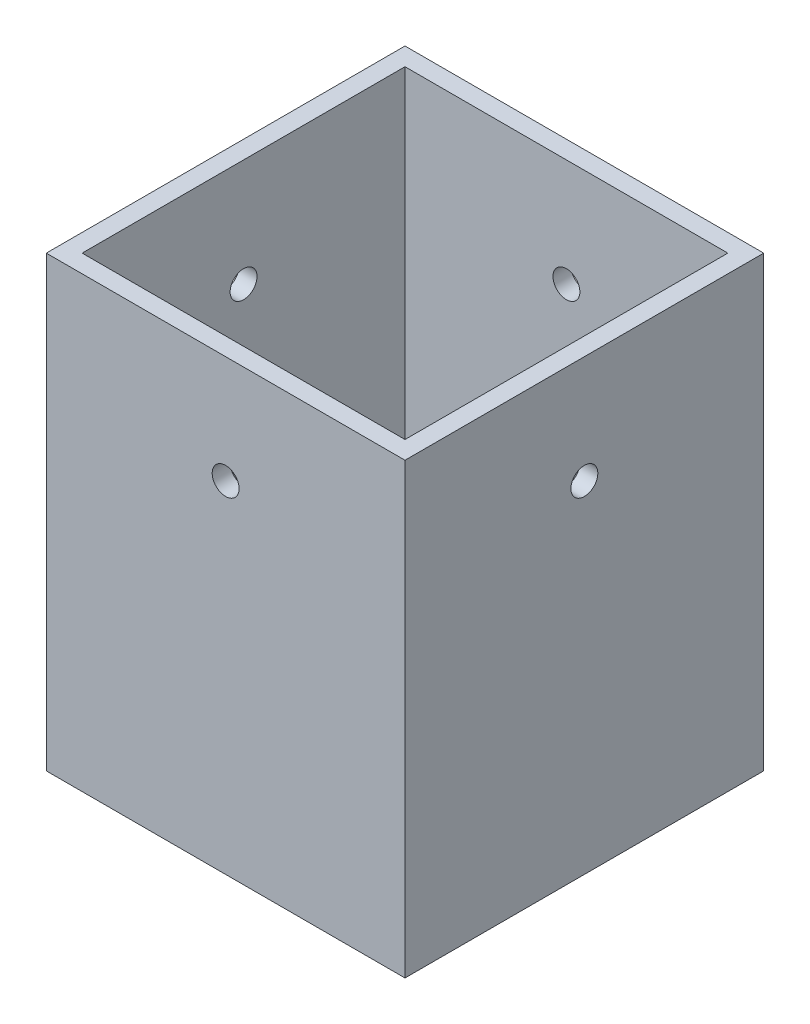
ISO-10303-21;
HEADER;
FILE_DESCRIPTION(('STEP AP214'),'2;1');
FILE_NAME('part.step','',(''),(''),'','','');
FILE_SCHEMA(('AUTOMOTIVE_DESIGN { 1 0 10303 214 1 1 1 1 }'));
ENDSEC;
DATA;
#1=APPLICATION_CONTEXT('core data for automotive mechanical design processes');
#2=APPLICATION_PROTOCOL_DEFINITION('international standard','automotive_design',2000,#1);
#3=PRODUCT_CONTEXT('',#1,'mechanical');
#4=PRODUCT('Part','Part','',(#3));
#5=PRODUCT_RELATED_PRODUCT_CATEGORY('part','',(#4));
#6=PRODUCT_DEFINITION_FORMATION('','',#4);
#7=PRODUCT_DEFINITION_CONTEXT('part definition',#1,'design');
#8=PRODUCT_DEFINITION('design','',#6,#7);
#9=PRODUCT_DEFINITION_SHAPE('','',#8);
#10=(LENGTH_UNIT() NAMED_UNIT(*) SI_UNIT(.MILLI.,.METRE.));
#11=(NAMED_UNIT(*) PLANE_ANGLE_UNIT() SI_UNIT($,.RADIAN.));
#12=(NAMED_UNIT(*) SI_UNIT($,.STERADIAN.) SOLID_ANGLE_UNIT());
#13=UNCERTAINTY_MEASURE_WITH_UNIT(LENGTH_MEASURE(1.E-05),#10,'distance_accuracy_value','');
#14=(GEOMETRIC_REPRESENTATION_CONTEXT(3) GLOBAL_UNCERTAINTY_ASSIGNED_CONTEXT((#13)) GLOBAL_UNIT_ASSIGNED_CONTEXT((#10,
#11,#12)) REPRESENTATION_CONTEXT('',''));
#15=CARTESIAN_POINT('',(0.,0.,0.));
#16=DIRECTION('',(0.,0.,1.));
#17=DIRECTION('',(1.,0.,0.));
#18=AXIS2_PLACEMENT_3D('',#15,#16,#17);
#19=CARTESIAN_POINT('',(0.,50.,0.));
#20=DIRECTION('',(1.,0.,0.));
#21=DIRECTION('',(0.,0.,-1.));
#22=AXIS2_PLACEMENT_3D('',#19,#20,#21);
#23=PLANE('',#22);
#24=CARTESIAN_POINT('',(0.,38.,20.));
#25=DIRECTION('',(1.,0.,0.));
#26=DIRECTION('',(0.,0.,-1.));
#27=AXIS2_PLACEMENT_3D('',#24,#25,#26);
#28=CIRCLE('',#27,1.5);
#29=CARTESIAN_POINT('',(0.,38.,18.5));
#30=VERTEX_POINT('',#29);
#31=EDGE_CURVE('E179',#30,#30,#28,.T.);
#32=ORIENTED_EDGE('',*,*,#31,.T.);
#33=EDGE_LOOP('',(#32));
#34=FACE_BOUND('',#33,.T.);
#35=DIRECTION('',(0.,0.,1.));
#36=VECTOR('',#35,1.);
#37=CARTESIAN_POINT('',(0.,0.,0.));
#38=LINE('',#37,#36);
#39=CARTESIAN_POINT('',(0.,0.,0.));
#40=VERTEX_POINT('',#39);
#41=CARTESIAN_POINT('',(0.,0.,40.));
#42=VERTEX_POINT('',#41);
#43=EDGE_CURVE('E149',#40,#42,#38,.T.);
#44=ORIENTED_EDGE('',*,*,#43,.T.);
#45=DIRECTION('',(0.,-1.,0.));
#46=VECTOR('',#45,1.);
#47=CARTESIAN_POINT('',(0.,50.,40.));
#48=LINE('',#47,#46);
#49=CARTESIAN_POINT('',(0.,50.,40.));
#50=VERTEX_POINT('',#49);
#51=EDGE_CURVE('E11',#50,#42,#48,.T.);
#52=ORIENTED_EDGE('',*,*,#51,.F.);
#53=DIRECTION('',(0.,0.,1.));
#54=VECTOR('',#53,1.);
#55=CARTESIAN_POINT('',(0.,50.,0.));
#56=LINE('',#55,#54);
#57=CARTESIAN_POINT('',(0.,50.,0.));
#58=VERTEX_POINT('',#57);
#59=EDGE_CURVE('E153',#58,#50,#56,.T.);
#60=ORIENTED_EDGE('',*,*,#59,.F.);
#61=DIRECTION('',(0.,-1.,0.));
#62=VECTOR('',#61,1.);
#63=CARTESIAN_POINT('',(0.,50.,0.));
#64=LINE('',#63,#62);
#65=EDGE_CURVE('E159',#58,#40,#64,.T.);
#66=ORIENTED_EDGE('',*,*,#65,.T.);
#67=EDGE_LOOP('',(#44,#52,#60,#66));
#68=FACE_BOUND('',#67,.T.);
#69=ADVANCED_FACE('F36',(#34,#68),#23,.F.);
#70=CARTESIAN_POINT('',(0.,50.,40.));
#71=DIRECTION('',(0.,0.,-1.));
#72=DIRECTION('',(-1.,0.,0.));
#73=AXIS2_PLACEMENT_3D('',#70,#71,#72);
#74=PLANE('',#73);
#75=CARTESIAN_POINT('',(20.,38.,40.));
#76=DIRECTION('',(0.,0.,1.));
#77=DIRECTION('',(1.,0.,0.));
#78=AXIS2_PLACEMENT_3D('',#75,#76,#77);
#79=CIRCLE('',#78,1.5);
#80=CARTESIAN_POINT('',(21.5,38.,40.));
#81=VERTEX_POINT('',#80);
#82=EDGE_CURVE('E174',#81,#81,#79,.T.);
#83=ORIENTED_EDGE('',*,*,#82,.F.);
#84=EDGE_LOOP('',(#83));
#85=FACE_BOUND('',#84,.T.);
#86=DIRECTION('',(1.,0.,0.));
#87=VECTOR('',#86,1.);
#88=CARTESIAN_POINT('',(0.,0.,40.));
#89=LINE('',#88,#87);
#90=CARTESIAN_POINT('',(40.,0.,40.));
#91=VERTEX_POINT('',#90);
#92=EDGE_CURVE('E162',#42,#91,#89,.T.);
#93=ORIENTED_EDGE('',*,*,#92,.T.);
#94=DIRECTION('',(0.,-1.,0.));
#95=VECTOR('',#94,1.);
#96=CARTESIAN_POINT('',(40.,50.,40.));
#97=LINE('',#96,#95);
#98=CARTESIAN_POINT('',(40.,50.,40.));
#99=VERTEX_POINT('',#98);
#100=EDGE_CURVE('E44',#99,#91,#97,.T.);
#101=ORIENTED_EDGE('',*,*,#100,.F.);
#102=DIRECTION('',(1.,0.,0.));
#103=VECTOR('',#102,1.);
#104=CARTESIAN_POINT('',(0.,50.,40.));
#105=LINE('',#104,#103);
#106=EDGE_CURVE('E89',#50,#99,#105,.T.);
#107=ORIENTED_EDGE('',*,*,#106,.F.);
#108=ORIENTED_EDGE('',*,*,#51,.T.);
#109=EDGE_LOOP('',(#93,#101,#107,#108));
#110=FACE_BOUND('',#109,.T.);
#111=ADVANCED_FACE('F213',(#85,#110),#74,.F.);
#112=CARTESIAN_POINT('',(40.,50.,0.));
#113=DIRECTION('',(-1.,0.,0.));
#114=DIRECTION('',(0.,0.,1.));
#115=AXIS2_PLACEMENT_3D('',#112,#113,#114);
#116=PLANE('',#115);
#117=CARTESIAN_POINT('',(40.,38.,20.));
#118=DIRECTION('',(1.,0.,0.));
#119=DIRECTION('',(0.,0.,-1.));
#120=AXIS2_PLACEMENT_3D('',#117,#118,#119);
#121=CIRCLE('',#120,1.5);
#122=CARTESIAN_POINT('',(40.,38.,18.5));
#123=VERTEX_POINT('',#122);
#124=EDGE_CURVE('E189',#123,#123,#121,.T.);
#125=ORIENTED_EDGE('',*,*,#124,.F.);
#126=EDGE_LOOP('',(#125));
#127=FACE_BOUND('',#126,.T.);
#128=DIRECTION('',(0.,0.,-1.));
#129=VECTOR('',#128,1.);
#130=CARTESIAN_POINT('',(40.,0.,0.));
#131=LINE('',#130,#129);
#132=CARTESIAN_POINT('',(40.,0.,0.));
#133=VERTEX_POINT('',#132);
#134=EDGE_CURVE('E164',#91,#133,#131,.T.);
#135=ORIENTED_EDGE('',*,*,#134,.T.);
#136=DIRECTION('',(0.,-1.,0.));
#137=VECTOR('',#136,1.);
#138=CARTESIAN_POINT('',(40.,50.,0.));
#139=LINE('',#138,#137);
#140=CARTESIAN_POINT('',(40.,50.,0.));
#141=VERTEX_POINT('',#140);
#142=EDGE_CURVE('E168',#141,#133,#139,.T.);
#143=ORIENTED_EDGE('',*,*,#142,.F.);
#144=DIRECTION('',(0.,0.,-1.));
#145=VECTOR('',#144,1.);
#146=CARTESIAN_POINT('',(40.,50.,0.));
#147=LINE('',#146,#145);
#148=EDGE_CURVE('E156',#99,#141,#147,.T.);
#149=ORIENTED_EDGE('',*,*,#148,.F.);
#150=ORIENTED_EDGE('',*,*,#100,.T.);
#151=EDGE_LOOP('',(#135,#143,#149,#150));
#152=FACE_BOUND('',#151,.T.);
#153=ADVANCED_FACE('F218',(#127,#152),#116,.F.);
#154=CARTESIAN_POINT('',(0.,50.,0.));
#155=DIRECTION('',(0.,0.,1.));
#156=DIRECTION('',(1.,0.,0.));
#157=AXIS2_PLACEMENT_3D('',#154,#155,#156);
#158=PLANE('',#157);
#159=CARTESIAN_POINT('',(20.,38.,0.));
#160=DIRECTION('',(0.,0.,1.));
#161=DIRECTION('',(1.,0.,0.));
#162=AXIS2_PLACEMENT_3D('',#159,#160,#161);
#163=CIRCLE('',#162,1.5);
#164=CARTESIAN_POINT('',(21.5,38.,0.));
#165=VERTEX_POINT('',#164);
#166=EDGE_CURVE('E137',#165,#165,#163,.T.);
#167=ORIENTED_EDGE('',*,*,#166,.T.);
#168=EDGE_LOOP('',(#167));
#169=FACE_BOUND('',#168,.T.);
#170=DIRECTION('',(-1.,0.,0.));
#171=VECTOR('',#170,1.);
#172=CARTESIAN_POINT('',(0.,0.,0.));
#173=LINE('',#172,#171);
#174=EDGE_CURVE('E82',#133,#40,#173,.T.);
#175=ORIENTED_EDGE('',*,*,#174,.T.);
#176=ORIENTED_EDGE('',*,*,#65,.F.);
#177=DIRECTION('',(-1.,0.,0.));
#178=VECTOR('',#177,1.);
#179=CARTESIAN_POINT('',(0.,50.,0.));
#180=LINE('',#179,#178);
#181=EDGE_CURVE('E61',#141,#58,#180,.T.);
#182=ORIENTED_EDGE('',*,*,#181,.F.);
#183=ORIENTED_EDGE('',*,*,#142,.T.);
#184=EDGE_LOOP('',(#175,#176,#182,#183));
#185=FACE_BOUND('',#184,.T.);
#186=ADVANCED_FACE('F233',(#169,#185),#158,.F.);
#187=CARTESIAN_POINT('',(0.,50.,0.));
#188=DIRECTION('',(0.,1.,0.));
#189=DIRECTION('',(0.,0.,1.));
#190=AXIS2_PLACEMENT_3D('',#187,#188,#189);
#191=PLANE('',#190);
#192=DIRECTION('',(0.,0.,1.));
#193=VECTOR('',#192,1.);
#194=CARTESIAN_POINT('',(2.,50.,38.));
#195=LINE('',#194,#193);
#196=CARTESIAN_POINT('',(2.,50.,2.));
#197=VERTEX_POINT('',#196);
#198=CARTESIAN_POINT('',(2.,50.,38.));
#199=VERTEX_POINT('',#198);
#200=EDGE_CURVE('E52',#197,#199,#195,.T.);
#201=ORIENTED_EDGE('',*,*,#200,.F.);
#202=DIRECTION('',(-1.,0.,0.));
#203=VECTOR('',#202,1.);
#204=CARTESIAN_POINT('',(38.,50.,1.99999999999999));
#205=LINE('',#204,#203);
#206=CARTESIAN_POINT('',(38.,50.,1.99999999999999));
#207=VERTEX_POINT('',#206);
#208=EDGE_CURVE('E131',#207,#197,#205,.T.);
#209=ORIENTED_EDGE('',*,*,#208,.F.);
#210=DIRECTION('',(0.,0.,-1.));
#211=VECTOR('',#210,1.);
#212=CARTESIAN_POINT('',(38.,50.,38.));
#213=LINE('',#212,#211);
#214=CARTESIAN_POINT('',(38.,50.,38.));
#215=VERTEX_POINT('',#214);
#216=EDGE_CURVE('E134',#215,#207,#213,.T.);
#217=ORIENTED_EDGE('',*,*,#216,.F.);
#218=DIRECTION('',(1.,0.,0.));
#219=VECTOR('',#218,1.);
#220=CARTESIAN_POINT('',(38.,50.,38.));
#221=LINE('',#220,#219);
#222=EDGE_CURVE('E143',#199,#215,#221,.T.);
#223=ORIENTED_EDGE('',*,*,#222,.F.);
#224=EDGE_LOOP('',(#201,#209,#217,#223));
#225=FACE_BOUND('',#224,.T.);
#226=ORIENTED_EDGE('',*,*,#59,.T.);
#227=ORIENTED_EDGE('',*,*,#106,.T.);
#228=ORIENTED_EDGE('',*,*,#148,.T.);
#229=ORIENTED_EDGE('',*,*,#181,.T.);
#230=EDGE_LOOP('',(#226,#227,#228,#229));
#231=FACE_BOUND('',#230,.T.);
#232=ADVANCED_FACE('F231',(#225,#231),#191,.T.);
#233=CARTESIAN_POINT('',(0.,0.,0.));
#234=DIRECTION('',(0.,1.,0.));
#235=DIRECTION('',(0.,0.,1.));
#236=AXIS2_PLACEMENT_3D('',#233,#234,#235);
#237=PLANE('',#236);
#238=ORIENTED_EDGE('',*,*,#43,.F.);
#239=ORIENTED_EDGE('',*,*,#174,.F.);
#240=ORIENTED_EDGE('',*,*,#134,.F.);
#241=ORIENTED_EDGE('',*,*,#92,.F.);
#242=EDGE_LOOP('',(#238,#239,#240,#241));
#243=FACE_BOUND('',#242,.T.);
#244=ADVANCED_FACE('F226',(#243),#237,.F.);
#245=CARTESIAN_POINT('',(2.,4.,38.));
#246=DIRECTION('',(-1.,0.,0.));
#247=DIRECTION('',(0.,0.,1.));
#248=AXIS2_PLACEMENT_3D('',#245,#246,#247);
#249=PLANE('',#248);
#250=CARTESIAN_POINT('',(2.,38.,20.));
#251=DIRECTION('',(-1.,0.,0.));
#252=DIRECTION('',(0.,0.,1.));
#253=AXIS2_PLACEMENT_3D('',#250,#251,#252);
#254=CIRCLE('',#253,1.5);
#255=CARTESIAN_POINT('',(2.,38.,21.5));
#256=VERTEX_POINT('',#255);
#257=EDGE_CURVE('E184',#256,#256,#254,.T.);
#258=ORIENTED_EDGE('',*,*,#257,.T.);
#259=EDGE_LOOP('',(#258));
#260=FACE_BOUND('',#259,.T.);
#261=ORIENTED_EDGE('',*,*,#200,.T.);
#262=DIRECTION('',(0.,1.,0.));
#263=VECTOR('',#262,1.);
#264=CARTESIAN_POINT('',(2.,4.,38.));
#265=LINE('',#264,#263);
#266=CARTESIAN_POINT('',(2.,4.,38.));
#267=VERTEX_POINT('',#266);
#268=EDGE_CURVE('E109',#267,#199,#265,.T.);
#269=ORIENTED_EDGE('',*,*,#268,.F.);
#270=DIRECTION('',(0.,0.,1.));
#271=VECTOR('',#270,1.);
#272=CARTESIAN_POINT('',(2.,4.,38.));
#273=LINE('',#272,#271);
#274=CARTESIAN_POINT('',(2.,4.,2.));
#275=VERTEX_POINT('',#274);
#276=EDGE_CURVE('E113',#275,#267,#273,.T.);
#277=ORIENTED_EDGE('',*,*,#276,.F.);
#278=DIRECTION('',(0.,1.,0.));
#279=VECTOR('',#278,1.);
#280=CARTESIAN_POINT('',(2.,4.,2.));
#281=LINE('',#280,#279);
#282=EDGE_CURVE('E147',#275,#197,#281,.T.);
#283=ORIENTED_EDGE('',*,*,#282,.T.);
#284=EDGE_LOOP('',(#261,#269,#277,#283));
#285=FACE_BOUND('',#284,.T.);
#286=ADVANCED_FACE('F111',(#260,#285),#249,.F.);
#287=CARTESIAN_POINT('',(38.,4.,1.99999999999999));
#288=DIRECTION('',(0.,0.,-1.));
#289=DIRECTION('',(-1.,0.,0.));
#290=AXIS2_PLACEMENT_3D('',#287,#288,#289);
#291=PLANE('',#290);
#292=CARTESIAN_POINT('',(20.,38.,1.99999999999999));
#293=DIRECTION('',(0.,0.,-1.));
#294=DIRECTION('',(-1.,0.,0.));
#295=AXIS2_PLACEMENT_3D('',#292,#293,#294);
#296=CIRCLE('',#295,1.5);
#297=CARTESIAN_POINT('',(18.5,38.,1.99999999999999));
#298=VERTEX_POINT('',#297);
#299=EDGE_CURVE('E173',#298,#298,#296,.T.);
#300=ORIENTED_EDGE('',*,*,#299,.T.);
#301=EDGE_LOOP('',(#300));
#302=FACE_BOUND('',#301,.T.);
#303=ORIENTED_EDGE('',*,*,#208,.T.);
#304=ORIENTED_EDGE('',*,*,#282,.F.);
#305=DIRECTION('',(-1.,0.,0.));
#306=VECTOR('',#305,1.);
#307=CARTESIAN_POINT('',(38.,4.,1.99999999999999));
#308=LINE('',#307,#306);
#309=CARTESIAN_POINT('',(38.,4.,1.99999999999999));
#310=VERTEX_POINT('',#309);
#311=EDGE_CURVE('E119',#310,#275,#308,.T.);
#312=ORIENTED_EDGE('',*,*,#311,.F.);
#313=DIRECTION('',(0.,1.,0.));
#314=VECTOR('',#313,1.);
#315=CARTESIAN_POINT('',(38.,4.,1.99999999999999));
#316=LINE('',#315,#314);
#317=EDGE_CURVE('E150',#310,#207,#316,.T.);
#318=ORIENTED_EDGE('',*,*,#317,.T.);
#319=EDGE_LOOP('',(#303,#304,#312,#318));
#320=FACE_BOUND('',#319,.T.);
#321=ADVANCED_FACE('F266',(#302,#320),#291,.F.);
#322=CARTESIAN_POINT('',(38.,4.,38.));
#323=DIRECTION('',(1.,0.,0.));
#324=DIRECTION('',(0.,0.,-1.));
#325=AXIS2_PLACEMENT_3D('',#322,#323,#324);
#326=PLANE('',#325);
#327=CARTESIAN_POINT('',(38.,38.,20.));
#328=DIRECTION('',(1.,0.,0.));
#329=DIRECTION('',(0.,0.,-1.));
#330=AXIS2_PLACEMENT_3D('',#327,#328,#329);
#331=CIRCLE('',#330,1.5);
#332=CARTESIAN_POINT('',(38.,38.,18.5));
#333=VERTEX_POINT('',#332);
#334=EDGE_CURVE('E39',#333,#333,#331,.T.);
#335=ORIENTED_EDGE('',*,*,#334,.T.);
#336=EDGE_LOOP('',(#335));
#337=FACE_BOUND('',#336,.T.);
#338=ORIENTED_EDGE('',*,*,#216,.T.);
#339=ORIENTED_EDGE('',*,*,#317,.F.);
#340=DIRECTION('',(0.,0.,-1.));
#341=VECTOR('',#340,1.);
#342=CARTESIAN_POINT('',(38.,4.,38.));
#343=LINE('',#342,#341);
#344=CARTESIAN_POINT('',(38.,4.,38.));
#345=VERTEX_POINT('',#344);
#346=EDGE_CURVE('E127',#345,#310,#343,.T.);
#347=ORIENTED_EDGE('',*,*,#346,.F.);
#348=DIRECTION('',(0.,1.,0.));
#349=VECTOR('',#348,1.);
#350=CARTESIAN_POINT('',(38.,4.,38.));
#351=LINE('',#350,#349);
#352=EDGE_CURVE('E118',#345,#215,#351,.T.);
#353=ORIENTED_EDGE('',*,*,#352,.T.);
#354=EDGE_LOOP('',(#338,#339,#347,#353));
#355=FACE_BOUND('',#354,.T.);
#356=ADVANCED_FACE('F196',(#337,#355),#326,.F.);
#357=CARTESIAN_POINT('',(38.,4.,38.));
#358=DIRECTION('',(0.,0.,1.));
#359=DIRECTION('',(1.,0.,0.));
#360=AXIS2_PLACEMENT_3D('',#357,#358,#359);
#361=PLANE('',#360);
#362=CARTESIAN_POINT('',(20.,38.,38.));
#363=DIRECTION('',(0.,0.,1.));
#364=DIRECTION('',(1.,0.,0.));
#365=AXIS2_PLACEMENT_3D('',#362,#363,#364);
#366=CIRCLE('',#365,1.5);
#367=CARTESIAN_POINT('',(21.5,38.,38.));
#368=VERTEX_POINT('',#367);
#369=EDGE_CURVE('E171',#368,#368,#366,.T.);
#370=ORIENTED_EDGE('',*,*,#369,.T.);
#371=EDGE_LOOP('',(#370));
#372=FACE_BOUND('',#371,.T.);
#373=ORIENTED_EDGE('',*,*,#222,.T.);
#374=ORIENTED_EDGE('',*,*,#352,.F.);
#375=DIRECTION('',(1.,0.,0.));
#376=VECTOR('',#375,1.);
#377=CARTESIAN_POINT('',(38.,4.,38.));
#378=LINE('',#377,#376);
#379=EDGE_CURVE('E122',#267,#345,#378,.T.);
#380=ORIENTED_EDGE('',*,*,#379,.F.);
#381=ORIENTED_EDGE('',*,*,#268,.T.);
#382=EDGE_LOOP('',(#373,#374,#380,#381));
#383=FACE_BOUND('',#382,.T.);
#384=ADVANCED_FACE('F123',(#372,#383),#361,.F.);
#385=CARTESIAN_POINT('',(0.,4.,0.));
#386=DIRECTION('',(0.,1.,0.));
#387=DIRECTION('',(0.,0.,1.));
#388=AXIS2_PLACEMENT_3D('',#385,#386,#387);
#389=PLANE('',#388);
#390=ORIENTED_EDGE('',*,*,#276,.T.);
#391=ORIENTED_EDGE('',*,*,#379,.T.);
#392=ORIENTED_EDGE('',*,*,#346,.T.);
#393=ORIENTED_EDGE('',*,*,#311,.T.);
#394=EDGE_LOOP('',(#390,#391,#392,#393));
#395=FACE_BOUND('',#394,.T.);
#396=ADVANCED_FACE('F129',(#395),#389,.T.);
#397=CARTESIAN_POINT('',(20.,38.,-6.));
#398=DIRECTION('',(0.,0.,1.));
#399=DIRECTION('',(1.,0.,0.));
#400=AXIS2_PLACEMENT_3D('',#397,#398,#399);
#401=CYLINDRICAL_SURFACE('',#400,1.5);
#402=ORIENTED_EDGE('',*,*,#82,.T.);
#403=EDGE_LOOP('',(#402));
#404=FACE_BOUND('',#403,.T.);
#405=ORIENTED_EDGE('',*,*,#369,.F.);
#406=EDGE_LOOP('',(#405));
#407=FACE_BOUND('',#406,.T.);
#408=ADVANCED_FACE('F209',(#404,#407),#401,.F.);
#409=ORIENTED_EDGE('',*,*,#299,.F.);
#410=EDGE_LOOP('',(#409));
#411=FACE_BOUND('',#410,.T.);
#412=ORIENTED_EDGE('',*,*,#166,.F.);
#413=EDGE_LOOP('',(#412));
#414=FACE_BOUND('',#413,.T.);
#415=ADVANCED_FACE('F202',(#411,#414),#401,.F.);
#416=CARTESIAN_POINT('',(-6.,38.,20.));
#417=DIRECTION('',(1.,0.,0.));
#418=DIRECTION('',(0.,0.,-1.));
#419=AXIS2_PLACEMENT_3D('',#416,#417,#418);
#420=CYLINDRICAL_SURFACE('',#419,1.5);
#421=ORIENTED_EDGE('',*,*,#124,.T.);
#422=EDGE_LOOP('',(#421));
#423=FACE_BOUND('',#422,.T.);
#424=ORIENTED_EDGE('',*,*,#334,.F.);
#425=EDGE_LOOP('',(#424));
#426=FACE_BOUND('',#425,.T.);
#427=ADVANCED_FACE('F199',(#423,#426),#420,.F.);
#428=ORIENTED_EDGE('',*,*,#257,.F.);
#429=EDGE_LOOP('',(#428));
#430=FACE_BOUND('',#429,.T.);
#431=ORIENTED_EDGE('',*,*,#31,.F.);
#432=EDGE_LOOP('',(#431));
#433=FACE_BOUND('',#432,.T.);
#434=ADVANCED_FACE('F201',(#430,#433),#420,.F.);
#435=CLOSED_SHELL('',(#69,#111,#153,#186,#232,#244,#286,#321,#356,#384,#396,#408,#415,#427,#434));
#436=MANIFOLD_SOLID_BREP('B2',#435);
#437=ADVANCED_BREP_SHAPE_REPRESENTATION('',(#18,#436),#14);
#438=SHAPE_DEFINITION_REPRESENTATION(#9,#437);
ENDSEC;
END-ISO-10303-21;
